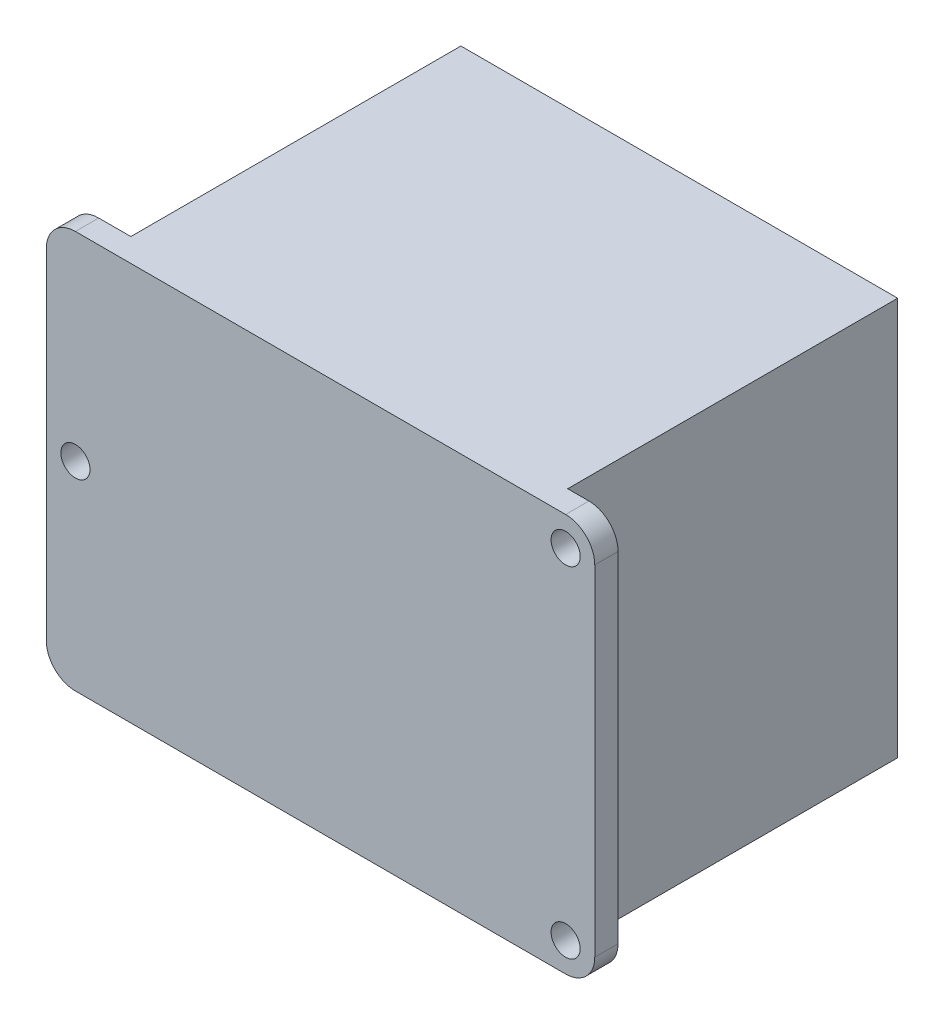
ISO-10303-21;
HEADER;
FILE_DESCRIPTION(('STEP AP214'),'2;1');
FILE_NAME('part.step','',(''),(''),'','','');
FILE_SCHEMA(('AUTOMOTIVE_DESIGN { 1 0 10303 214 1 1 1 1 }'));
ENDSEC;
DATA;
#1=APPLICATION_CONTEXT('core data for automotive mechanical design processes');
#2=APPLICATION_PROTOCOL_DEFINITION('international standard','automotive_design',2000,#1);
#3=PRODUCT_CONTEXT('',#1,'mechanical');
#4=PRODUCT('Part','Part','',(#3));
#5=PRODUCT_RELATED_PRODUCT_CATEGORY('part','',(#4));
#6=PRODUCT_DEFINITION_FORMATION('','',#4);
#7=PRODUCT_DEFINITION_CONTEXT('part definition',#1,'design');
#8=PRODUCT_DEFINITION('design','',#6,#7);
#9=PRODUCT_DEFINITION_SHAPE('','',#8);
#10=(LENGTH_UNIT() NAMED_UNIT(*) SI_UNIT(.MILLI.,.METRE.));
#11=(NAMED_UNIT(*) PLANE_ANGLE_UNIT() SI_UNIT($,.RADIAN.));
#12=(NAMED_UNIT(*) SI_UNIT($,.STERADIAN.) SOLID_ANGLE_UNIT());
#13=UNCERTAINTY_MEASURE_WITH_UNIT(LENGTH_MEASURE(1.E-05),#10,'distance_accuracy_value','');
#14=(GEOMETRIC_REPRESENTATION_CONTEXT(3) GLOBAL_UNCERTAINTY_ASSIGNED_CONTEXT((#13)) GLOBAL_UNIT_ASSIGNED_CONTEXT((#10,
#11,#12)) REPRESENTATION_CONTEXT('',''));
#15=CARTESIAN_POINT('',(0.,0.,0.));
#16=DIRECTION('',(0.,0.,1.));
#17=DIRECTION('',(1.,0.,0.));
#18=AXIS2_PLACEMENT_3D('',#15,#16,#17);
#19=CARTESIAN_POINT('',(0.,0.,0.));
#20=DIRECTION('',(0.,0.,1.));
#21=DIRECTION('',(1.,0.,0.));
#22=AXIS2_PLACEMENT_3D('',#19,#20,#21);
#23=PLANE('',#22);
#24=CARTESIAN_POINT('',(3.,-20.5,0.));
#25=DIRECTION('',(0.,0.,1.));
#26=DIRECTION('',(1.,0.,0.));
#27=AXIS2_PLACEMENT_3D('',#24,#25,#26);
#28=CIRCLE('',#27,1.5);
#29=CARTESIAN_POINT('',(4.5,-20.5,0.));
#30=VERTEX_POINT('',#29);
#31=EDGE_CURVE('E154',#30,#30,#28,.T.);
#32=ORIENTED_EDGE('',*,*,#31,.T.);
#33=EDGE_LOOP('',(#32));
#34=FACE_BOUND('',#33,.T.);
#35=DIRECTION('',(0.,-1.,0.));
#36=VECTOR('',#35,1.);
#37=CARTESIAN_POINT('',(0.,0.,0.));
#38=LINE('',#37,#36);
#39=CARTESIAN_POINT('',(0.,-3.,0.));
#40=VERTEX_POINT('',#39);
#41=CARTESIAN_POINT('',(0.,-38.,0.));
#42=VERTEX_POINT('',#41);
#43=EDGE_CURVE('E177',#40,#42,#38,.T.);
#44=ORIENTED_EDGE('',*,*,#43,.F.);
#45=CARTESIAN_POINT('',(3.,-3.,0.));
#46=DIRECTION('',(0.,0.,1.));
#47=DIRECTION('',(1.,0.,0.));
#48=AXIS2_PLACEMENT_3D('',#45,#46,#47);
#49=CIRCLE('',#48,3.);
#50=CARTESIAN_POINT('',(3.,0.,0.));
#51=VERTEX_POINT('',#50);
#52=EDGE_CURVE('E11',#40,#51,#49,.F.);
#53=ORIENTED_EDGE('',*,*,#52,.T.);
#54=DIRECTION('',(-1.,0.,0.));
#55=VECTOR('',#54,1.);
#56=CARTESIAN_POINT('',(0.,0.,0.));
#57=LINE('',#56,#55);
#58=CARTESIAN_POINT('',(6.3092801211883,0.,0.));
#59=VERTEX_POINT('',#58);
#60=EDGE_CURVE('E199',#59,#51,#57,.T.);
#61=ORIENTED_EDGE('',*,*,#60,.F.);
#62=DIRECTION('',(0.,1.,0.));
#63=VECTOR('',#62,1.);
#64=CARTESIAN_POINT('',(6.3092801211883,-41.,0.));
#65=LINE('',#64,#63);
#66=CARTESIAN_POINT('',(6.3092801211883,-41.,0.));
#67=VERTEX_POINT('',#66);
#68=EDGE_CURVE('E153',#67,#59,#65,.T.);
#69=ORIENTED_EDGE('',*,*,#68,.F.);
#70=DIRECTION('',(1.,0.,0.));
#71=VECTOR('',#70,1.);
#72=CARTESIAN_POINT('',(0.,-41.,0.));
#73=LINE('',#72,#71);
#74=CARTESIAN_POINT('',(3.,-41.,0.));
#75=VERTEX_POINT('',#74);
#76=EDGE_CURVE('E194',#75,#67,#73,.T.);
#77=ORIENTED_EDGE('',*,*,#76,.F.);
#78=CARTESIAN_POINT('',(3.,-38.,0.));
#79=DIRECTION('',(0.,0.,1.));
#80=DIRECTION('',(1.,0.,0.));
#81=AXIS2_PLACEMENT_3D('',#78,#79,#80);
#82=CIRCLE('',#81,3.);
#83=EDGE_CURVE('E47',#75,#42,#82,.F.);
#84=ORIENTED_EDGE('',*,*,#83,.T.);
#85=EDGE_LOOP('',(#44,#53,#61,#69,#77,#84));
#86=FACE_BOUND('',#85,.T.);
#87=ADVANCED_FACE('F39',(#34,#86),#23,.F.);
#88=CARTESIAN_POINT('',(53.5,-38.,0.));
#89=DIRECTION('',(0.,0.,1.));
#90=DIRECTION('',(1.,0.,0.));
#91=AXIS2_PLACEMENT_3D('',#88,#89,#90);
#92=CIRCLE('',#91,1.5);
#93=CARTESIAN_POINT('',(55.,-38.,0.));
#94=VERTEX_POINT('',#93);
#95=EDGE_CURVE('E157',#94,#94,#92,.T.);
#96=ORIENTED_EDGE('',*,*,#95,.T.);
#97=EDGE_LOOP('',(#96));
#98=FACE_BOUND('',#97,.T.);
#99=CARTESIAN_POINT('',(53.5,-3.,0.));
#100=DIRECTION('',(0.,0.,1.));
#101=DIRECTION('',(1.,0.,0.));
#102=AXIS2_PLACEMENT_3D('',#99,#100,#101);
#103=CIRCLE('',#102,1.5);
#104=CARTESIAN_POINT('',(55.,-3.,0.));
#105=VERTEX_POINT('',#104);
#106=EDGE_CURVE('E163',#105,#105,#103,.T.);
#107=ORIENTED_EDGE('',*,*,#106,.T.);
#108=EDGE_LOOP('',(#107));
#109=FACE_BOUND('',#108,.T.);
#110=DIRECTION('',(0.,1.,0.));
#111=VECTOR('',#110,1.);
#112=CARTESIAN_POINT('',(56.5,0.,0.));
#113=LINE('',#112,#111);
#114=CARTESIAN_POINT('',(56.5,-38.,0.));
#115=VERTEX_POINT('',#114);
#116=CARTESIAN_POINT('',(56.5,-3.,0.));
#117=VERTEX_POINT('',#116);
#118=EDGE_CURVE('E196',#115,#117,#113,.T.);
#119=ORIENTED_EDGE('',*,*,#118,.F.);
#120=CARTESIAN_POINT('',(53.5,-38.,0.));
#121=DIRECTION('',(0.,0.,1.));
#122=DIRECTION('',(1.,0.,0.));
#123=AXIS2_PLACEMENT_3D('',#120,#121,#122);
#124=CIRCLE('',#123,3.);
#125=CARTESIAN_POINT('',(53.5,-41.,0.));
#126=VERTEX_POINT('',#125);
#127=EDGE_CURVE('E207',#115,#126,#124,.F.);
#128=ORIENTED_EDGE('',*,*,#127,.T.);
#129=CARTESIAN_POINT('',(51.3092801211883,-41.,0.));
#130=VERTEX_POINT('',#129);
#131=EDGE_CURVE('E193',#130,#126,#73,.T.);
#132=ORIENTED_EDGE('',*,*,#131,.F.);
#133=DIRECTION('',(0.,-1.,0.));
#134=VECTOR('',#133,1.);
#135=CARTESIAN_POINT('',(51.3092801211883,-41.,0.));
#136=LINE('',#135,#134);
#137=CARTESIAN_POINT('',(51.3092801211883,0.,0.));
#138=VERTEX_POINT('',#137);
#139=EDGE_CURVE('E149',#138,#130,#136,.T.);
#140=ORIENTED_EDGE('',*,*,#139,.F.);
#141=CARTESIAN_POINT('',(53.5,0.,0.));
#142=VERTEX_POINT('',#141);
#143=EDGE_CURVE('E182',#142,#138,#57,.T.);
#144=ORIENTED_EDGE('',*,*,#143,.F.);
#145=CARTESIAN_POINT('',(53.5,-3.,0.));
#146=DIRECTION('',(0.,0.,1.));
#147=DIRECTION('',(1.,0.,0.));
#148=AXIS2_PLACEMENT_3D('',#145,#146,#147);
#149=CIRCLE('',#148,3.);
#150=EDGE_CURVE('E205',#142,#117,#149,.F.);
#151=ORIENTED_EDGE('',*,*,#150,.T.);
#152=EDGE_LOOP('',(#119,#128,#132,#140,#144,#151));
#153=FACE_BOUND('',#152,.T.);
#154=ADVANCED_FACE('F247',(#98,#109,#153),#23,.F.);
#155=CARTESIAN_POINT('',(0.,0.,2.4));
#156=DIRECTION('',(1.,0.,0.));
#157=DIRECTION('',(0.,1.,0.));
#158=AXIS2_PLACEMENT_3D('',#155,#156,#157);
#159=PLANE('',#158);
#160=DIRECTION('',(0.,-1.,0.));
#161=VECTOR('',#160,1.);
#162=CARTESIAN_POINT('',(0.,0.,2.4));
#163=LINE('',#162,#161);
#164=CARTESIAN_POINT('',(0.,-3.,2.4));
#165=VERTEX_POINT('',#164);
#166=CARTESIAN_POINT('',(0.,-38.,2.4));
#167=VERTEX_POINT('',#166);
#168=EDGE_CURVE('E178',#165,#167,#163,.T.);
#169=ORIENTED_EDGE('',*,*,#168,.F.);
#170=DIRECTION('',(0.,0.,-1.));
#171=VECTOR('',#170,1.);
#172=CARTESIAN_POINT('',(0.,-3.,2.4));
#173=LINE('',#172,#171);
#174=EDGE_CURVE('E229',#165,#40,#173,.T.);
#175=ORIENTED_EDGE('',*,*,#174,.T.);
#176=ORIENTED_EDGE('',*,*,#43,.T.);
#177=DIRECTION('',(0.,0.,-1.));
#178=VECTOR('',#177,1.);
#179=CARTESIAN_POINT('',(0.,-38.,2.4));
#180=LINE('',#179,#178);
#181=EDGE_CURVE('E227',#42,#167,#180,.F.);
#182=ORIENTED_EDGE('',*,*,#181,.T.);
#183=EDGE_LOOP('',(#169,#175,#176,#182));
#184=FACE_BOUND('',#183,.T.);
#185=ADVANCED_FACE('F232',(#184),#159,.F.);
#186=CARTESIAN_POINT('',(0.,-41.,2.4));
#187=DIRECTION('',(0.,1.,0.));
#188=DIRECTION('',(0.,0.,1.));
#189=AXIS2_PLACEMENT_3D('',#186,#187,#188);
#190=PLANE('',#189);
#191=ORIENTED_EDGE('',*,*,#131,.T.);
#192=DIRECTION('',(0.,0.,-1.));
#193=VECTOR('',#192,1.);
#194=CARTESIAN_POINT('',(53.5,-41.,2.4));
#195=LINE('',#194,#193);
#196=CARTESIAN_POINT('',(53.5,-41.,2.4));
#197=VERTEX_POINT('',#196);
#198=EDGE_CURVE('E212',#126,#197,#195,.F.);
#199=ORIENTED_EDGE('',*,*,#198,.T.);
#200=DIRECTION('',(1.,0.,0.));
#201=VECTOR('',#200,1.);
#202=CARTESIAN_POINT('',(0.,-41.,2.4));
#203=LINE('',#202,#201);
#204=CARTESIAN_POINT('',(3.,-41.,2.4));
#205=VERTEX_POINT('',#204);
#206=EDGE_CURVE('E181',#205,#197,#203,.T.);
#207=ORIENTED_EDGE('',*,*,#206,.F.);
#208=DIRECTION('',(0.,0.,-1.));
#209=VECTOR('',#208,1.);
#210=CARTESIAN_POINT('',(3.,-41.,2.4));
#211=LINE('',#210,#209);
#212=EDGE_CURVE('E209',#205,#75,#211,.T.);
#213=ORIENTED_EDGE('',*,*,#212,.T.);
#214=ORIENTED_EDGE('',*,*,#76,.T.);
#215=DIRECTION('',(0.,0.,1.));
#216=VECTOR('',#215,1.);
#217=CARTESIAN_POINT('',(6.3092801211883,-41.,-34.));
#218=LINE('',#217,#216);
#219=CARTESIAN_POINT('',(6.3092801211883,-41.,-34.));
#220=VERTEX_POINT('',#219);
#221=EDGE_CURVE('E265',#220,#67,#218,.T.);
#222=ORIENTED_EDGE('',*,*,#221,.F.);
#223=DIRECTION('',(-1.,0.,0.));
#224=VECTOR('',#223,1.);
#225=CARTESIAN_POINT('',(6.3092801211883,-41.,-34.));
#226=LINE('',#225,#224);
#227=CARTESIAN_POINT('',(51.3092801211883,-41.,-34.));
#228=VERTEX_POINT('',#227);
#229=EDGE_CURVE('E145',#228,#220,#226,.T.);
#230=ORIENTED_EDGE('',*,*,#229,.F.);
#231=DIRECTION('',(0.,0.,1.));
#232=VECTOR('',#231,1.);
#233=CARTESIAN_POINT('',(51.3092801211883,-41.,-34.));
#234=LINE('',#233,#232);
#235=EDGE_CURVE('E159',#228,#130,#234,.T.);
#236=ORIENTED_EDGE('',*,*,#235,.T.);
#237=EDGE_LOOP('',(#191,#199,#207,#213,#214,#222,#230,#236));
#238=FACE_BOUND('',#237,.T.);
#239=ADVANCED_FACE('F261',(#238),#190,.F.);
#240=CARTESIAN_POINT('',(56.5,0.,2.4));
#241=DIRECTION('',(-1.,0.,0.));
#242=DIRECTION('',(0.,0.,1.));
#243=AXIS2_PLACEMENT_3D('',#240,#241,#242);
#244=PLANE('',#243);
#245=DIRECTION('',(0.,1.,0.));
#246=VECTOR('',#245,1.);
#247=CARTESIAN_POINT('',(56.5,0.,2.4));
#248=LINE('',#247,#246);
#249=CARTESIAN_POINT('',(56.5,-38.,2.4));
#250=VERTEX_POINT('',#249);
#251=CARTESIAN_POINT('',(56.5,-3.,2.4));
#252=VERTEX_POINT('',#251);
#253=EDGE_CURVE('E185',#250,#252,#248,.T.);
#254=ORIENTED_EDGE('',*,*,#253,.F.);
#255=DIRECTION('',(0.,0.,-1.));
#256=VECTOR('',#255,1.);
#257=CARTESIAN_POINT('',(56.5,-38.,2.4));
#258=LINE('',#257,#256);
#259=EDGE_CURVE('E202',#250,#115,#258,.T.);
#260=ORIENTED_EDGE('',*,*,#259,.T.);
#261=ORIENTED_EDGE('',*,*,#118,.T.);
#262=DIRECTION('',(0.,0.,-1.));
#263=VECTOR('',#262,1.);
#264=CARTESIAN_POINT('',(56.5,-3.,2.4));
#265=LINE('',#264,#263);
#266=EDGE_CURVE('E191',#117,#252,#265,.F.);
#267=ORIENTED_EDGE('',*,*,#266,.T.);
#268=EDGE_LOOP('',(#254,#260,#261,#267));
#269=FACE_BOUND('',#268,.T.);
#270=ADVANCED_FACE('F251',(#269),#244,.F.);
#271=CARTESIAN_POINT('',(0.,0.,2.4));
#272=DIRECTION('',(0.,-1.,0.));
#273=DIRECTION('',(0.,0.,-1.));
#274=AXIS2_PLACEMENT_3D('',#271,#272,#273);
#275=PLANE('',#274);
#276=DIRECTION('',(-1.,0.,0.));
#277=VECTOR('',#276,1.);
#278=CARTESIAN_POINT('',(0.,0.,2.4));
#279=LINE('',#278,#277);
#280=CARTESIAN_POINT('',(53.5,0.,2.4));
#281=VERTEX_POINT('',#280);
#282=CARTESIAN_POINT('',(3.,0.,2.4));
#283=VERTEX_POINT('',#282);
#284=EDGE_CURVE('E188',#281,#283,#279,.T.);
#285=ORIENTED_EDGE('',*,*,#284,.F.);
#286=DIRECTION('',(0.,0.,-1.));
#287=VECTOR('',#286,1.);
#288=CARTESIAN_POINT('',(53.5,0.,2.4));
#289=LINE('',#288,#287);
#290=EDGE_CURVE('E224',#281,#142,#289,.T.);
#291=ORIENTED_EDGE('',*,*,#290,.T.);
#292=ORIENTED_EDGE('',*,*,#143,.T.);
#293=DIRECTION('',(0.,0.,1.));
#294=VECTOR('',#293,1.);
#295=CARTESIAN_POINT('',(51.3092801211883,0.,-34.));
#296=LINE('',#295,#294);
#297=CARTESIAN_POINT('',(51.3092801211883,0.,-34.));
#298=VERTEX_POINT('',#297);
#299=EDGE_CURVE('E136',#298,#138,#296,.T.);
#300=ORIENTED_EDGE('',*,*,#299,.F.);
#301=DIRECTION('',(1.,0.,0.));
#302=VECTOR('',#301,1.);
#303=CARTESIAN_POINT('',(6.3092801211883,0.,-34.));
#304=LINE('',#303,#302);
#305=CARTESIAN_POINT('',(6.3092801211883,0.,-34.));
#306=VERTEX_POINT('',#305);
#307=EDGE_CURVE('E127',#306,#298,#304,.T.);
#308=ORIENTED_EDGE('',*,*,#307,.F.);
#309=DIRECTION('',(0.,0.,1.));
#310=VECTOR('',#309,1.);
#311=CARTESIAN_POINT('',(6.3092801211883,0.,-34.));
#312=LINE('',#311,#310);
#313=EDGE_CURVE('E133',#306,#59,#312,.T.);
#314=ORIENTED_EDGE('',*,*,#313,.T.);
#315=ORIENTED_EDGE('',*,*,#60,.T.);
#316=DIRECTION('',(0.,0.,-1.));
#317=VECTOR('',#316,1.);
#318=CARTESIAN_POINT('',(3.,0.,2.4));
#319=LINE('',#318,#317);
#320=EDGE_CURVE('E222',#51,#283,#319,.F.);
#321=ORIENTED_EDGE('',*,*,#320,.T.);
#322=EDGE_LOOP('',(#285,#291,#292,#300,#308,#314,#315,#321));
#323=FACE_BOUND('',#322,.T.);
#324=ADVANCED_FACE('F130',(#323),#275,.F.);
#325=CARTESIAN_POINT('',(0.,0.,2.4));
#326=DIRECTION('',(0.,0.,1.));
#327=DIRECTION('',(1.,0.,0.));
#328=AXIS2_PLACEMENT_3D('',#325,#326,#327);
#329=PLANE('',#328);
#330=CARTESIAN_POINT('',(53.5,-3.,2.4));
#331=DIRECTION('',(0.,0.,1.));
#332=DIRECTION('',(1.,0.,0.));
#333=AXIS2_PLACEMENT_3D('',#330,#331,#332);
#334=CIRCLE('',#333,1.5);
#335=CARTESIAN_POINT('',(55.,-3.,2.4));
#336=VERTEX_POINT('',#335);
#337=EDGE_CURVE('E174',#336,#336,#334,.T.);
#338=ORIENTED_EDGE('',*,*,#337,.F.);
#339=EDGE_LOOP('',(#338));
#340=FACE_BOUND('',#339,.T.);
#341=CARTESIAN_POINT('',(53.5,-38.,2.4));
#342=DIRECTION('',(0.,0.,1.));
#343=DIRECTION('',(1.,0.,0.));
#344=AXIS2_PLACEMENT_3D('',#341,#342,#343);
#345=CIRCLE('',#344,1.5);
#346=CARTESIAN_POINT('',(55.,-38.,2.4));
#347=VERTEX_POINT('',#346);
#348=EDGE_CURVE('E171',#347,#347,#345,.T.);
#349=ORIENTED_EDGE('',*,*,#348,.F.);
#350=EDGE_LOOP('',(#349));
#351=FACE_BOUND('',#350,.T.);
#352=CARTESIAN_POINT('',(3.,-20.5,2.4));
#353=DIRECTION('',(0.,0.,1.));
#354=DIRECTION('',(1.,0.,0.));
#355=AXIS2_PLACEMENT_3D('',#352,#353,#354);
#356=CIRCLE('',#355,1.5);
#357=CARTESIAN_POINT('',(4.5,-20.5,2.4));
#358=VERTEX_POINT('',#357);
#359=EDGE_CURVE('E166',#358,#358,#356,.T.);
#360=ORIENTED_EDGE('',*,*,#359,.F.);
#361=EDGE_LOOP('',(#360));
#362=FACE_BOUND('',#361,.T.);
#363=ORIENTED_EDGE('',*,*,#206,.T.);
#364=CARTESIAN_POINT('',(53.5,-38.,2.4));
#365=DIRECTION('',(0.,0.,1.));
#366=DIRECTION('',(1.,0.,0.));
#367=AXIS2_PLACEMENT_3D('',#364,#365,#366);
#368=CIRCLE('',#367,3.);
#369=EDGE_CURVE('E220',#197,#250,#368,.T.);
#370=ORIENTED_EDGE('',*,*,#369,.T.);
#371=ORIENTED_EDGE('',*,*,#253,.T.);
#372=CARTESIAN_POINT('',(53.5,-3.,2.4));
#373=DIRECTION('',(0.,0.,1.));
#374=DIRECTION('',(1.,0.,0.));
#375=AXIS2_PLACEMENT_3D('',#372,#373,#374);
#376=CIRCLE('',#375,3.);
#377=EDGE_CURVE('E218',#252,#281,#376,.T.);
#378=ORIENTED_EDGE('',*,*,#377,.T.);
#379=ORIENTED_EDGE('',*,*,#284,.T.);
#380=CARTESIAN_POINT('',(3.,-3.,2.4));
#381=DIRECTION('',(0.,0.,1.));
#382=DIRECTION('',(1.,0.,0.));
#383=AXIS2_PLACEMENT_3D('',#380,#381,#382);
#384=CIRCLE('',#383,3.);
#385=EDGE_CURVE('E216',#283,#165,#384,.T.);
#386=ORIENTED_EDGE('',*,*,#385,.T.);
#387=ORIENTED_EDGE('',*,*,#168,.T.);
#388=CARTESIAN_POINT('',(3.,-38.,2.4));
#389=DIRECTION('',(0.,0.,1.));
#390=DIRECTION('',(1.,0.,0.));
#391=AXIS2_PLACEMENT_3D('',#388,#389,#390);
#392=CIRCLE('',#391,3.);
#393=EDGE_CURVE('E214',#167,#205,#392,.T.);
#394=ORIENTED_EDGE('',*,*,#393,.T.);
#395=EDGE_LOOP('',(#363,#370,#371,#378,#379,#386,#387,#394));
#396=FACE_BOUND('',#395,.T.);
#397=ADVANCED_FACE('F237',(#340,#351,#362,#396),#329,.T.);
#398=CARTESIAN_POINT('',(3.,-20.5,0.));
#399=DIRECTION('',(0.,0.,1.));
#400=DIRECTION('',(1.,0.,0.));
#401=AXIS2_PLACEMENT_3D('',#398,#399,#400);
#402=CYLINDRICAL_SURFACE('',#401,1.5);
#403=ORIENTED_EDGE('',*,*,#359,.T.);
#404=EDGE_LOOP('',(#403));
#405=FACE_BOUND('',#404,.T.);
#406=ORIENTED_EDGE('',*,*,#31,.F.);
#407=EDGE_LOOP('',(#406));
#408=FACE_BOUND('',#407,.T.);
#409=ADVANCED_FACE('F336',(#405,#408),#402,.F.);
#410=CARTESIAN_POINT('',(53.5,-38.,0.));
#411=DIRECTION('',(0.,0.,1.));
#412=DIRECTION('',(1.,0.,0.));
#413=AXIS2_PLACEMENT_3D('',#410,#411,#412);
#414=CYLINDRICAL_SURFACE('',#413,1.5);
#415=ORIENTED_EDGE('',*,*,#348,.T.);
#416=EDGE_LOOP('',(#415));
#417=FACE_BOUND('',#416,.T.);
#418=ORIENTED_EDGE('',*,*,#95,.F.);
#419=EDGE_LOOP('',(#418));
#420=FACE_BOUND('',#419,.T.);
#421=ADVANCED_FACE('F398',(#417,#420),#414,.F.);
#422=CARTESIAN_POINT('',(53.5,-3.,0.));
#423=DIRECTION('',(0.,0.,1.));
#424=DIRECTION('',(1.,0.,0.));
#425=AXIS2_PLACEMENT_3D('',#422,#423,#424);
#426=CYLINDRICAL_SURFACE('',#425,1.5);
#427=ORIENTED_EDGE('',*,*,#337,.T.);
#428=EDGE_LOOP('',(#427));
#429=FACE_BOUND('',#428,.T.);
#430=ORIENTED_EDGE('',*,*,#106,.F.);
#431=EDGE_LOOP('',(#430));
#432=FACE_BOUND('',#431,.T.);
#433=ADVANCED_FACE('F279',(#429,#432),#426,.F.);
#434=CARTESIAN_POINT('',(6.3092801211883,-41.,-34.));
#435=DIRECTION('',(1.,0.,0.));
#436=DIRECTION('',(0.,0.,-1.));
#437=AXIS2_PLACEMENT_3D('',#434,#435,#436);
#438=PLANE('',#437);
#439=ORIENTED_EDGE('',*,*,#68,.T.);
#440=ORIENTED_EDGE('',*,*,#313,.F.);
#441=DIRECTION('',(0.,1.,0.));
#442=VECTOR('',#441,1.);
#443=CARTESIAN_POINT('',(6.3092801211883,-41.,-34.));
#444=LINE('',#443,#442);
#445=EDGE_CURVE('E140',#220,#306,#444,.T.);
#446=ORIENTED_EDGE('',*,*,#445,.F.);
#447=ORIENTED_EDGE('',*,*,#221,.T.);
#448=EDGE_LOOP('',(#439,#440,#446,#447));
#449=FACE_BOUND('',#448,.T.);
#450=ADVANCED_FACE('F151',(#449),#438,.F.);
#451=CARTESIAN_POINT('',(51.3092801211883,-41.,-34.));
#452=DIRECTION('',(-1.,0.,0.));
#453=DIRECTION('',(0.,0.,1.));
#454=AXIS2_PLACEMENT_3D('',#451,#452,#453);
#455=PLANE('',#454);
#456=ORIENTED_EDGE('',*,*,#139,.T.);
#457=ORIENTED_EDGE('',*,*,#235,.F.);
#458=DIRECTION('',(0.,-1.,0.));
#459=VECTOR('',#458,1.);
#460=CARTESIAN_POINT('',(51.3092801211883,-41.,-34.));
#461=LINE('',#460,#459);
#462=EDGE_CURVE('E139',#298,#228,#461,.T.);
#463=ORIENTED_EDGE('',*,*,#462,.F.);
#464=ORIENTED_EDGE('',*,*,#299,.T.);
#465=EDGE_LOOP('',(#456,#457,#463,#464));
#466=FACE_BOUND('',#465,.T.);
#467=ADVANCED_FACE('F271',(#466),#455,.F.);
#468=CARTESIAN_POINT('',(0.,0.,-34.));
#469=DIRECTION('',(0.,0.,-1.));
#470=DIRECTION('',(-1.,0.,0.));
#471=AXIS2_PLACEMENT_3D('',#468,#469,#470);
#472=PLANE('',#471);
#473=ORIENTED_EDGE('',*,*,#445,.T.);
#474=ORIENTED_EDGE('',*,*,#307,.T.);
#475=ORIENTED_EDGE('',*,*,#462,.T.);
#476=ORIENTED_EDGE('',*,*,#229,.T.);
#477=EDGE_LOOP('',(#473,#474,#475,#476));
#478=FACE_BOUND('',#477,.T.);
#479=ADVANCED_FACE('F143',(#478),#472,.T.);
#480=CARTESIAN_POINT('',(53.5,-38.,2.4));
#481=DIRECTION('',(0.,0.,-1.));
#482=DIRECTION('',(-1.,0.,0.));
#483=AXIS2_PLACEMENT_3D('',#480,#481,#482);
#484=CYLINDRICAL_SURFACE('',#483,3.);
#485=ORIENTED_EDGE('',*,*,#369,.F.);
#486=ORIENTED_EDGE('',*,*,#198,.F.);
#487=ORIENTED_EDGE('',*,*,#127,.F.);
#488=ORIENTED_EDGE('',*,*,#259,.F.);
#489=EDGE_LOOP('',(#485,#486,#487,#488));
#490=FACE_BOUND('',#489,.T.);
#491=ADVANCED_FACE('F255',(#490),#484,.T.);
#492=CARTESIAN_POINT('',(53.5,-3.,2.4));
#493=DIRECTION('',(0.,0.,-1.));
#494=DIRECTION('',(-1.,0.,0.));
#495=AXIS2_PLACEMENT_3D('',#492,#493,#494);
#496=CYLINDRICAL_SURFACE('',#495,3.);
#497=ORIENTED_EDGE('',*,*,#377,.F.);
#498=ORIENTED_EDGE('',*,*,#266,.F.);
#499=ORIENTED_EDGE('',*,*,#150,.F.);
#500=ORIENTED_EDGE('',*,*,#290,.F.);
#501=EDGE_LOOP('',(#497,#498,#499,#500));
#502=FACE_BOUND('',#501,.T.);
#503=ADVANCED_FACE('F243',(#502),#496,.T.);
#504=CARTESIAN_POINT('',(3.,-3.,2.4));
#505=DIRECTION('',(0.,0.,-1.));
#506=DIRECTION('',(-1.,0.,0.));
#507=AXIS2_PLACEMENT_3D('',#504,#505,#506);
#508=CYLINDRICAL_SURFACE('',#507,3.);
#509=ORIENTED_EDGE('',*,*,#385,.F.);
#510=ORIENTED_EDGE('',*,*,#320,.F.);
#511=ORIENTED_EDGE('',*,*,#52,.F.);
#512=ORIENTED_EDGE('',*,*,#174,.F.);
#513=EDGE_LOOP('',(#509,#510,#511,#512));
#514=FACE_BOUND('',#513,.T.);
#515=ADVANCED_FACE('F235',(#514),#508,.T.);
#516=CARTESIAN_POINT('',(3.,-38.,2.4));
#517=DIRECTION('',(0.,0.,-1.));
#518=DIRECTION('',(-1.,0.,0.));
#519=AXIS2_PLACEMENT_3D('',#516,#517,#518);
#520=CYLINDRICAL_SURFACE('',#519,3.);
#521=ORIENTED_EDGE('',*,*,#393,.F.);
#522=ORIENTED_EDGE('',*,*,#181,.F.);
#523=ORIENTED_EDGE('',*,*,#83,.F.);
#524=ORIENTED_EDGE('',*,*,#212,.F.);
#525=EDGE_LOOP('',(#521,#522,#523,#524));
#526=FACE_BOUND('',#525,.T.);
#527=ADVANCED_FACE('F41',(#526),#520,.T.);
#528=CLOSED_SHELL('',(#87,#154,#185,#239,#270,#324,#397,#409,#421,#433,#450,#467,#479,#491,#503,
#515,#527));
#529=MANIFOLD_SOLID_BREP('B2',#528);
#530=ADVANCED_BREP_SHAPE_REPRESENTATION('',(#18,#529),#14);
#531=SHAPE_DEFINITION_REPRESENTATION(#9,#530);
ENDSEC;
END-ISO-10303-21;
